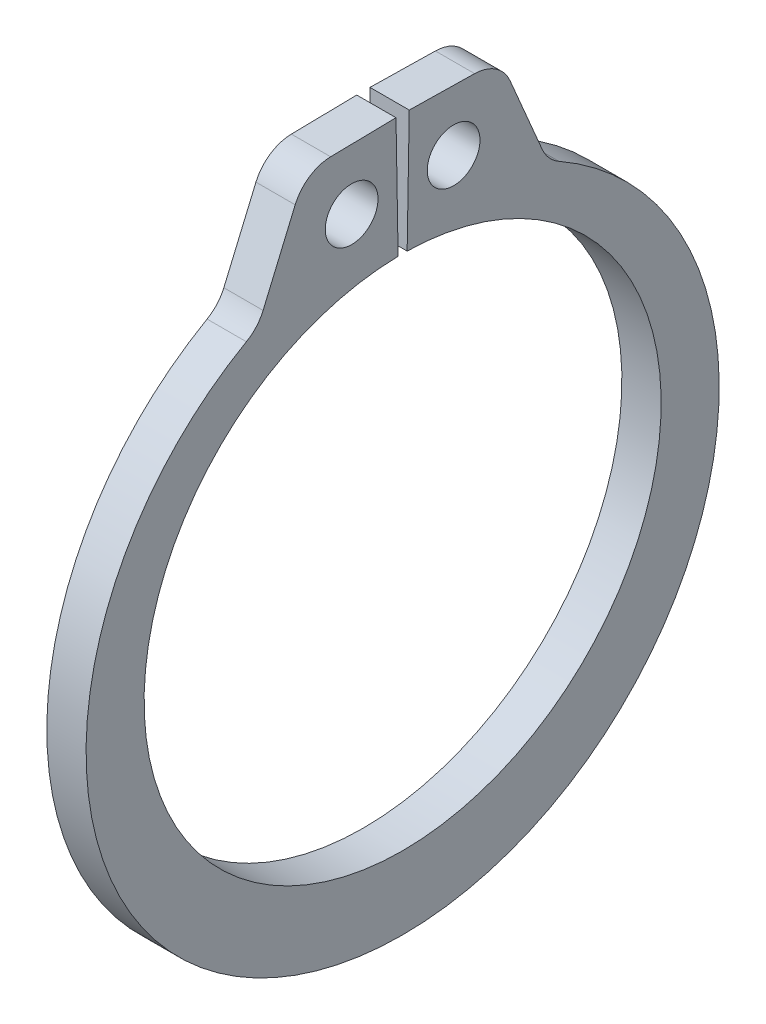
ISO-10303-21;
HEADER;
FILE_DESCRIPTION(('STEP AP214'),'2;1');
FILE_NAME('part.step','',(''),(''),'','','');
FILE_SCHEMA(('AUTOMOTIVE_DESIGN { 1 0 10303 214 1 1 1 1 }'));
ENDSEC;
DATA;
#1=APPLICATION_CONTEXT('core data for automotive mechanical design processes');
#2=APPLICATION_PROTOCOL_DEFINITION('international standard','automotive_design',2000,#1);
#3=PRODUCT_CONTEXT('',#1,'mechanical');
#4=PRODUCT('Part','Part','',(#3));
#5=PRODUCT_RELATED_PRODUCT_CATEGORY('part','',(#4));
#6=PRODUCT_DEFINITION_FORMATION('','',#4);
#7=PRODUCT_DEFINITION_CONTEXT('part definition',#1,'design');
#8=PRODUCT_DEFINITION('design','',#6,#7);
#9=PRODUCT_DEFINITION_SHAPE('','',#8);
#10=(LENGTH_UNIT() NAMED_UNIT(*) SI_UNIT(.MILLI.,.METRE.));
#11=(NAMED_UNIT(*) PLANE_ANGLE_UNIT() SI_UNIT($,.RADIAN.));
#12=(NAMED_UNIT(*) SI_UNIT($,.STERADIAN.) SOLID_ANGLE_UNIT());
#13=UNCERTAINTY_MEASURE_WITH_UNIT(LENGTH_MEASURE(1.E-05),#10,'distance_accuracy_value','');
#14=(GEOMETRIC_REPRESENTATION_CONTEXT(3) GLOBAL_UNCERTAINTY_ASSIGNED_CONTEXT((#13)) GLOBAL_UNIT_ASSIGNED_CONTEXT((#10,
#11,#12)) REPRESENTATION_CONTEXT('',''));
#15=CARTESIAN_POINT('',(0.,0.,0.));
#16=DIRECTION('',(0.,0.,1.));
#17=DIRECTION('',(1.,0.,0.));
#18=AXIS2_PLACEMENT_3D('',#15,#16,#17);
#19=CARTESIAN_POINT('',(0.4445,0.,0.));
#20=DIRECTION('',(1.,0.,0.));
#21=DIRECTION('',(0.,0.,-1.));
#22=AXIS2_PLACEMENT_3D('',#19,#20,#21);
#23=PLANE('',#22);
#24=CARTESIAN_POINT('',(0.4445,7.20724610900659,1.15465964864512));
#25=DIRECTION('',(1.,0.,0.));
#26=DIRECTION('',(0.,0.,-1.));
#27=AXIS2_PLACEMENT_3D('',#24,#25,#26);
#28=CIRCLE('',#27,0.5969);
#29=CARTESIAN_POINT('',(0.4445,7.20724610900659,0.557759648645121));
#30=VERTEX_POINT('',#29);
#31=EDGE_CURVE('E222',#30,#30,#28,.T.);
#32=ORIENTED_EDGE('',*,*,#31,.F.);
#33=EDGE_LOOP('',(#32));
#34=FACE_BOUND('',#33,.T.);
#35=DIRECTION('',(0.,-0.0174524064372841,0.999847695156391));
#36=VECTOR('',#35,1.);
#37=CARTESIAN_POINT('',(0.4445,8.59659049818514,0.150054045307121));
#38=LINE('',#37,#36);
#39=CARTESIAN_POINT('',(0.4445,8.59659049818514,0.150054045307121));
#40=VERTEX_POINT('',#39);
#41=CARTESIAN_POINT('',(0.4445,8.57074959100772,1.63047862600547));
#42=VERTEX_POINT('',#41);
#43=EDGE_CURVE('E134',#40,#42,#38,.T.);
#44=ORIENTED_EDGE('',*,*,#43,.T.);
#45=CARTESIAN_POINT('',(0.4445,7.68188499001368,1.61496343668273));
#46=DIRECTION('',(1.,0.,0.));
#47=DIRECTION('',(0.,0.,-1.));
#48=AXIS2_PLACEMENT_3D('',#45,#46,#47);
#49=CIRCLE('',#48,0.889);
#50=CARTESIAN_POINT('',(0.4445,8.02998759243226,2.43297662617873));
#51=VERTEX_POINT('',#50);
#52=EDGE_CURVE('E175',#42,#51,#49,.T.);
#53=ORIENTED_EDGE('',*,*,#52,.T.);
#54=DIRECTION('',(0.,-0.920149819455567,0.391566481910655));
#55=VECTOR('',#54,1.);
#56=CARTESIAN_POINT('',(0.4445,8.56068391718107,2.20714069332188));
#57=LINE('',#56,#55);
#58=CARTESIAN_POINT('',(0.4445,6.32221463110736,3.15971333386378));
#59=VERTEX_POINT('',#58);
#60=EDGE_CURVE('E214',#51,#59,#57,.T.);
#61=ORIENTED_EDGE('',*,*,#60,.T.);
#62=CARTESIAN_POINT('',(0.4445,6.67031723352593,3.97772652335978));
#63=DIRECTION('',(1.,0.,0.));
#64=DIRECTION('',(0.,0.,-1.));
#65=AXIS2_PLACEMENT_3D('',#62,#63,#64);
#66=CIRCLE('',#65,0.889);
#67=CARTESIAN_POINT('',(0.4445,5.89719335877508,3.53886381784672));
#68=VERTEX_POINT('',#67);
#69=EDGE_CURVE('E182',#59,#68,#66,.F.);
#70=ORIENTED_EDGE('',*,*,#69,.T.);
#71=CARTESIAN_POINT('',(0.4445,-0.337057291142251,0.));
#72=DIRECTION('',(1.,0.,0.));
#73=DIRECTION('',(0.,0.,-1.));
#74=AXIS2_PLACEMENT_3D('',#71,#72,#73);
#75=CIRCLE('',#74,7.16864270885775);
#76=CARTESIAN_POINT('',(0.4445,5.89719335877508,-3.53886381784672));
#77=VERTEX_POINT('',#76);
#78=EDGE_CURVE('E207',#68,#77,#75,.T.);
#79=ORIENTED_EDGE('',*,*,#78,.T.);
#80=CARTESIAN_POINT('',(0.4445,6.67031723352593,-3.97772652335978));
#81=DIRECTION('',(1.,0.,0.));
#82=DIRECTION('',(0.,0.,-1.));
#83=AXIS2_PLACEMENT_3D('',#80,#81,#82);
#84=CIRCLE('',#83,0.889);
#85=CARTESIAN_POINT('',(0.4445,6.32221463110736,-3.15971333386378));
#86=VERTEX_POINT('',#85);
#87=EDGE_CURVE('E11',#77,#86,#84,.F.);
#88=ORIENTED_EDGE('',*,*,#87,.T.);
#89=DIRECTION('',(0.,0.920149819455567,0.391566481910655));
#90=VECTOR('',#89,1.);
#91=CARTESIAN_POINT('',(0.4445,8.56068391718107,-2.20714069332188));
#92=LINE('',#91,#90);
#93=CARTESIAN_POINT('',(0.4445,8.02998759243226,-2.43297662617873));
#94=VERTEX_POINT('',#93);
#95=EDGE_CURVE('E206',#86,#94,#92,.T.);
#96=ORIENTED_EDGE('',*,*,#95,.T.);
#97=CARTESIAN_POINT('',(0.4445,7.68188499001368,-1.61496343668273));
#98=DIRECTION('',(1.,0.,0.));
#99=DIRECTION('',(0.,0.,-1.));
#100=AXIS2_PLACEMENT_3D('',#97,#98,#99);
#101=CIRCLE('',#100,0.889);
#102=CARTESIAN_POINT('',(0.4445,8.57074959100772,-1.63047862600547));
#103=VERTEX_POINT('',#102);
#104=EDGE_CURVE('E50',#94,#103,#101,.T.);
#105=ORIENTED_EDGE('',*,*,#104,.T.);
#106=DIRECTION('',(0.,0.0174524064372841,0.999847695156391));
#107=VECTOR('',#106,1.);
#108=CARTESIAN_POINT('',(0.4445,8.59659049818514,-0.150054045307121));
#109=LINE('',#108,#107);
#110=CARTESIAN_POINT('',(0.4445,8.59659049818514,-0.150054045307121));
#111=VERTEX_POINT('',#110);
#112=EDGE_CURVE('E211',#103,#111,#109,.T.);
#113=ORIENTED_EDGE('',*,*,#112,.T.);
#114=DIRECTION('',(0.,-0.999847695156391,0.0174524064372836));
#115=VECTOR('',#114,1.);
#116=CARTESIAN_POINT('',(0.4445,5.85380830083212,-0.102178603968364));
#117=LINE('',#116,#115);
#118=CARTESIAN_POINT('',(0.4445,5.85380830083212,-0.102178603968364));
#119=VERTEX_POINT('',#118);
#120=EDGE_CURVE('E140',#111,#119,#117,.T.);
#121=ORIENTED_EDGE('',*,*,#120,.T.);
#122=CARTESIAN_POINT('',(0.4445,0.,0.));
#123=DIRECTION('',(-1.,0.,0.));
#124=DIRECTION('',(0.,0.,-1.));
#125=AXIS2_PLACEMENT_3D('',#122,#123,#124);
#126=CIRCLE('',#125,5.8547);
#127=CARTESIAN_POINT('',(0.4445,5.85380830083212,0.102178603968364));
#128=VERTEX_POINT('',#127);
#129=EDGE_CURVE('E135',#119,#128,#126,.T.);
#130=ORIENTED_EDGE('',*,*,#129,.T.);
#131=DIRECTION('',(0.,0.999847695156391,0.0174524064372836));
#132=VECTOR('',#131,1.);
#133=CARTESIAN_POINT('',(0.4445,5.85380830083212,0.102178603968364));
#134=LINE('',#133,#132);
#135=EDGE_CURVE('E126',#128,#40,#134,.T.);
#136=ORIENTED_EDGE('',*,*,#135,.T.);
#137=EDGE_LOOP('',(#44,#53,#61,#70,#79,#88,#96,#105,#113,#121,#130,#136));
#138=FACE_BOUND('',#137,.T.);
#139=CARTESIAN_POINT('',(0.4445,7.20724610900659,-1.15465964864512));
#140=DIRECTION('',(1.,0.,0.));
#141=DIRECTION('',(0.,0.,-1.));
#142=AXIS2_PLACEMENT_3D('',#139,#140,#141);
#143=CIRCLE('',#142,0.5969);
#144=CARTESIAN_POINT('',(0.4445,7.20724610900659,-1.75155964864512));
#145=VERTEX_POINT('',#144);
#146=EDGE_CURVE('E248',#145,#145,#143,.T.);
#147=ORIENTED_EDGE('',*,*,#146,.F.);
#148=EDGE_LOOP('',(#147));
#149=FACE_BOUND('',#148,.T.);
#150=ADVANCED_FACE('F35',(#34,#138,#149),#23,.T.);
#151=CARTESIAN_POINT('',(-0.4445,0.,0.));
#152=DIRECTION('',(1.,0.,0.));
#153=DIRECTION('',(0.,0.,-1.));
#154=AXIS2_PLACEMENT_3D('',#151,#152,#153);
#155=PLANE('',#154);
#156=CARTESIAN_POINT('',(-0.4445,7.20724610900659,1.15465964864512));
#157=DIRECTION('',(1.,0.,0.));
#158=DIRECTION('',(0.,0.,-1.));
#159=AXIS2_PLACEMENT_3D('',#156,#157,#158);
#160=CIRCLE('',#159,0.5969);
#161=CARTESIAN_POINT('',(-0.4445,7.20724610900659,0.557759648645121));
#162=VERTEX_POINT('',#161);
#163=EDGE_CURVE('E245',#162,#162,#160,.T.);
#164=ORIENTED_EDGE('',*,*,#163,.T.);
#165=EDGE_LOOP('',(#164));
#166=FACE_BOUND('',#165,.T.);
#167=DIRECTION('',(0.,-0.920149819455567,0.391566481910655));
#168=VECTOR('',#167,1.);
#169=CARTESIAN_POINT('',(-0.4445,8.56068391718107,2.20714069332188));
#170=LINE('',#169,#168);
#171=CARTESIAN_POINT('',(-0.4445,8.02998759243226,2.43297662617873));
#172=VERTEX_POINT('',#171);
#173=CARTESIAN_POINT('',(-0.4445,6.32221463110736,3.15971333386378));
#174=VERTEX_POINT('',#173);
#175=EDGE_CURVE('E201',#172,#174,#170,.T.);
#176=ORIENTED_EDGE('',*,*,#175,.F.);
#177=CARTESIAN_POINT('',(-0.4445,7.68188499001368,1.61496343668273));
#178=DIRECTION('',(1.,0.,0.));
#179=DIRECTION('',(0.,0.,-1.));
#180=AXIS2_PLACEMENT_3D('',#177,#178,#179);
#181=CIRCLE('',#180,0.889);
#182=CARTESIAN_POINT('',(-0.4445,8.57074959100772,1.63047862600547));
#183=VERTEX_POINT('',#182);
#184=EDGE_CURVE('E171',#172,#183,#181,.F.);
#185=ORIENTED_EDGE('',*,*,#184,.T.);
#186=DIRECTION('',(0.,-0.0174524064372841,0.999847695156391));
#187=VECTOR('',#186,1.);
#188=CARTESIAN_POINT('',(-0.4445,8.59659049818514,0.150054045307121));
#189=LINE('',#188,#187);
#190=CARTESIAN_POINT('',(-0.4445,8.59659049818514,0.150054045307121));
#191=VERTEX_POINT('',#190);
#192=EDGE_CURVE('E224',#191,#183,#189,.T.);
#193=ORIENTED_EDGE('',*,*,#192,.F.);
#194=DIRECTION('',(0.,0.999847695156391,0.0174524064372836));
#195=VECTOR('',#194,1.);
#196=CARTESIAN_POINT('',(-0.4445,5.85380830083212,0.102178603968364));
#197=LINE('',#196,#195);
#198=CARTESIAN_POINT('',(-0.4445,5.85380830083212,0.102178603968364));
#199=VERTEX_POINT('',#198);
#200=EDGE_CURVE('E221',#199,#191,#197,.T.);
#201=ORIENTED_EDGE('',*,*,#200,.F.);
#202=CARTESIAN_POINT('',(-0.4445,0.,0.));
#203=DIRECTION('',(-1.,0.,0.));
#204=DIRECTION('',(0.,0.,-1.));
#205=AXIS2_PLACEMENT_3D('',#202,#203,#204);
#206=CIRCLE('',#205,5.8547);
#207=CARTESIAN_POINT('',(-0.4445,5.85380830083212,-0.102178603968364));
#208=VERTEX_POINT('',#207);
#209=EDGE_CURVE('E148',#208,#199,#206,.T.);
#210=ORIENTED_EDGE('',*,*,#209,.F.);
#211=DIRECTION('',(0.,-0.999847695156391,0.0174524064372836));
#212=VECTOR('',#211,1.);
#213=CARTESIAN_POINT('',(-0.4445,5.85380830083212,-0.102178603968364));
#214=LINE('',#213,#212);
#215=CARTESIAN_POINT('',(-0.4445,8.59659049818514,-0.150054045307121));
#216=VERTEX_POINT('',#215);
#217=EDGE_CURVE('E144',#216,#208,#214,.T.);
#218=ORIENTED_EDGE('',*,*,#217,.F.);
#219=DIRECTION('',(0.,0.0174524064372841,0.999847695156391));
#220=VECTOR('',#219,1.);
#221=CARTESIAN_POINT('',(-0.4445,8.59659049818514,-0.150054045307121));
#222=LINE('',#221,#220);
#223=CARTESIAN_POINT('',(-0.4445,8.57074959100772,-1.63047862600547));
#224=VERTEX_POINT('',#223);
#225=EDGE_CURVE('E229',#224,#216,#222,.T.);
#226=ORIENTED_EDGE('',*,*,#225,.F.);
#227=CARTESIAN_POINT('',(-0.4445,7.68188499001368,-1.61496343668273));
#228=DIRECTION('',(1.,0.,0.));
#229=DIRECTION('',(0.,0.,-1.));
#230=AXIS2_PLACEMENT_3D('',#227,#228,#229);
#231=CIRCLE('',#230,0.889);
#232=CARTESIAN_POINT('',(-0.4445,8.02998759243226,-2.43297662617873));
#233=VERTEX_POINT('',#232);
#234=EDGE_CURVE('E169',#224,#233,#231,.F.);
#235=ORIENTED_EDGE('',*,*,#234,.T.);
#236=DIRECTION('',(0.,0.920149819455567,0.391566481910655));
#237=VECTOR('',#236,1.);
#238=CARTESIAN_POINT('',(-0.4445,8.56068391718107,-2.20714069332188));
#239=LINE('',#238,#237);
#240=CARTESIAN_POINT('',(-0.4445,6.32221463110736,-3.15971333386378));
#241=VERTEX_POINT('',#240);
#242=EDGE_CURVE('E192',#241,#233,#239,.T.);
#243=ORIENTED_EDGE('',*,*,#242,.F.);
#244=CARTESIAN_POINT('',(-0.4445,6.67031723352593,-3.97772652335978));
#245=DIRECTION('',(1.,0.,0.));
#246=DIRECTION('',(0.,0.,-1.));
#247=AXIS2_PLACEMENT_3D('',#244,#245,#246);
#248=CIRCLE('',#247,0.889);
#249=CARTESIAN_POINT('',(-0.4445,5.89719335877508,-3.53886381784672));
#250=VERTEX_POINT('',#249);
#251=EDGE_CURVE('E43',#241,#250,#248,.T.);
#252=ORIENTED_EDGE('',*,*,#251,.T.);
#253=CARTESIAN_POINT('',(-0.4445,-0.337057291142251,0.));
#254=DIRECTION('',(1.,0.,0.));
#255=DIRECTION('',(0.,0.,-1.));
#256=AXIS2_PLACEMENT_3D('',#253,#254,#255);
#257=CIRCLE('',#256,7.16864270885775);
#258=CARTESIAN_POINT('',(-0.4445,5.89719335877508,3.53886381784672));
#259=VERTEX_POINT('',#258);
#260=EDGE_CURVE('E190',#259,#250,#257,.T.);
#261=ORIENTED_EDGE('',*,*,#260,.F.);
#262=CARTESIAN_POINT('',(-0.4445,6.67031723352593,3.97772652335978));
#263=DIRECTION('',(1.,0.,0.));
#264=DIRECTION('',(0.,0.,-1.));
#265=AXIS2_PLACEMENT_3D('',#262,#263,#264);
#266=CIRCLE('',#265,0.889);
#267=EDGE_CURVE('E180',#259,#174,#266,.T.);
#268=ORIENTED_EDGE('',*,*,#267,.T.);
#269=EDGE_LOOP('',(#176,#185,#193,#201,#210,#218,#226,#235,#243,#252,#261,#268));
#270=FACE_BOUND('',#269,.T.);
#271=CARTESIAN_POINT('',(-0.4445,7.20724610900659,-1.15465964864512));
#272=DIRECTION('',(1.,0.,0.));
#273=DIRECTION('',(0.,0.,-1.));
#274=AXIS2_PLACEMENT_3D('',#271,#272,#273);
#275=CIRCLE('',#274,0.5969);
#276=CARTESIAN_POINT('',(-0.4445,7.20724610900659,-1.75155964864512));
#277=VERTEX_POINT('',#276);
#278=EDGE_CURVE('E251',#277,#277,#275,.T.);
#279=ORIENTED_EDGE('',*,*,#278,.T.);
#280=EDGE_LOOP('',(#279));
#281=FACE_BOUND('',#280,.T.);
#282=ADVANCED_FACE('F188',(#166,#270,#281),#155,.F.);
#283=CARTESIAN_POINT('',(0.4445,0.,0.));
#284=DIRECTION('',(-1.,0.,0.));
#285=DIRECTION('',(0.,0.,1.));
#286=AXIS2_PLACEMENT_3D('',#283,#284,#285);
#287=CYLINDRICAL_SURFACE('',#286,5.8547);
#288=ORIENTED_EDGE('',*,*,#209,.T.);
#289=DIRECTION('',(-1.,0.,0.));
#290=VECTOR('',#289,1.);
#291=CARTESIAN_POINT('',(0.4445,5.85380830083212,0.102178603968364));
#292=LINE('',#291,#290);
#293=EDGE_CURVE('E130',#128,#199,#292,.T.);
#294=ORIENTED_EDGE('',*,*,#293,.F.);
#295=ORIENTED_EDGE('',*,*,#129,.F.);
#296=DIRECTION('',(-1.,0.,0.));
#297=VECTOR('',#296,1.);
#298=CARTESIAN_POINT('',(0.4445,5.85380830083212,-0.102178603968364));
#299=LINE('',#298,#297);
#300=EDGE_CURVE('E219',#119,#208,#299,.T.);
#301=ORIENTED_EDGE('',*,*,#300,.T.);
#302=EDGE_LOOP('',(#288,#294,#295,#301));
#303=FACE_BOUND('',#302,.T.);
#304=ADVANCED_FACE('F146',(#303),#287,.F.);
#305=CARTESIAN_POINT('',(0.4445,5.85380830083212,0.102178603968364));
#306=DIRECTION('',(0.,-0.0174524064372836,0.999847695156391));
#307=DIRECTION('',(0.,-0.999847695156391,-0.0174524064372836));
#308=AXIS2_PLACEMENT_3D('',#305,#306,#307);
#309=PLANE('',#308);
#310=ORIENTED_EDGE('',*,*,#200,.T.);
#311=DIRECTION('',(-1.,0.,0.));
#312=VECTOR('',#311,1.);
#313=CARTESIAN_POINT('',(0.4445,8.59659049818514,0.150054045307121));
#314=LINE('',#313,#312);
#315=EDGE_CURVE('E133',#40,#191,#314,.T.);
#316=ORIENTED_EDGE('',*,*,#315,.F.);
#317=ORIENTED_EDGE('',*,*,#135,.F.);
#318=ORIENTED_EDGE('',*,*,#293,.T.);
#319=EDGE_LOOP('',(#310,#316,#317,#318));
#320=FACE_BOUND('',#319,.T.);
#321=ADVANCED_FACE('F128',(#320),#309,.F.);
#322=CARTESIAN_POINT('',(0.4445,8.59659049818514,0.150054045307121));
#323=DIRECTION('',(0.,-0.999847695156391,-0.0174524064372841));
#324=DIRECTION('',(0.,0.0174524064372841,-0.999847695156391));
#325=AXIS2_PLACEMENT_3D('',#322,#323,#324);
#326=PLANE('',#325);
#327=ORIENTED_EDGE('',*,*,#192,.T.);
#328=DIRECTION('',(-1.,0.,0.));
#329=VECTOR('',#328,1.);
#330=CARTESIAN_POINT('',(0.4445,8.57074959100772,1.63047862600547));
#331=LINE('',#330,#329);
#332=EDGE_CURVE('E58',#183,#42,#331,.F.);
#333=ORIENTED_EDGE('',*,*,#332,.T.);
#334=ORIENTED_EDGE('',*,*,#43,.F.);
#335=ORIENTED_EDGE('',*,*,#315,.T.);
#336=EDGE_LOOP('',(#327,#333,#334,#335));
#337=FACE_BOUND('',#336,.T.);
#338=ADVANCED_FACE('F240',(#337),#326,.F.);
#339=CARTESIAN_POINT('',(0.4445,8.56068391718107,2.20714069332188));
#340=DIRECTION('',(0.,-0.391566481910655,-0.920149819455567));
#341=DIRECTION('',(0.,0.920149819455567,-0.391566481910655));
#342=AXIS2_PLACEMENT_3D('',#339,#340,#341);
#343=PLANE('',#342);
#344=ORIENTED_EDGE('',*,*,#175,.T.);
#345=DIRECTION('',(1.,0.,0.));
#346=VECTOR('',#345,1.);
#347=CARTESIAN_POINT('',(0.4445,6.32221463110736,3.15971333386378));
#348=LINE('',#347,#346);
#349=EDGE_CURVE('E162',#174,#59,#348,.T.);
#350=ORIENTED_EDGE('',*,*,#349,.T.);
#351=ORIENTED_EDGE('',*,*,#60,.F.);
#352=DIRECTION('',(-1.,0.,0.));
#353=VECTOR('',#352,1.);
#354=CARTESIAN_POINT('',(0.4445,8.02998759243226,2.43297662617873));
#355=LINE('',#354,#353);
#356=EDGE_CURVE('E159',#51,#172,#355,.T.);
#357=ORIENTED_EDGE('',*,*,#356,.T.);
#358=EDGE_LOOP('',(#344,#350,#351,#357));
#359=FACE_BOUND('',#358,.T.);
#360=ADVANCED_FACE('F281',(#359),#343,.F.);
#361=CARTESIAN_POINT('',(0.4445,-0.337057291142251,0.));
#362=DIRECTION('',(-1.,0.,0.));
#363=DIRECTION('',(0.,0.,1.));
#364=AXIS2_PLACEMENT_3D('',#361,#362,#363);
#365=CYLINDRICAL_SURFACE('',#364,7.16864270885775);
#366=ORIENTED_EDGE('',*,*,#78,.F.);
#367=DIRECTION('',(-1.,0.,0.));
#368=VECTOR('',#367,1.);
#369=CARTESIAN_POINT('',(0.4445,5.89719335877508,3.53886381784672));
#370=LINE('',#369,#368);
#371=EDGE_CURVE('E151',#68,#259,#370,.T.);
#372=ORIENTED_EDGE('',*,*,#371,.T.);
#373=ORIENTED_EDGE('',*,*,#260,.T.);
#374=DIRECTION('',(-1.,0.,0.));
#375=VECTOR('',#374,1.);
#376=CARTESIAN_POINT('',(0.4445,5.89719335877508,-3.53886381784672));
#377=LINE('',#376,#375);
#378=EDGE_CURVE('E149',#250,#77,#377,.F.);
#379=ORIENTED_EDGE('',*,*,#378,.T.);
#380=EDGE_LOOP('',(#366,#372,#373,#379));
#381=FACE_BOUND('',#380,.T.);
#382=ADVANCED_FACE('F198',(#381),#365,.T.);
#383=CARTESIAN_POINT('',(0.4445,8.56068391718107,-2.20714069332188));
#384=DIRECTION('',(0.,-0.391566481910655,0.920149819455567));
#385=DIRECTION('',(0.,-0.920149819455567,-0.391566481910655));
#386=AXIS2_PLACEMENT_3D('',#383,#384,#385);
#387=PLANE('',#386);
#388=ORIENTED_EDGE('',*,*,#95,.F.);
#389=DIRECTION('',(1.,0.,0.));
#390=VECTOR('',#389,1.);
#391=CARTESIAN_POINT('',(-0.4445,6.32221463110736,-3.15971333386378));
#392=LINE('',#391,#390);
#393=EDGE_CURVE('E166',#86,#241,#392,.F.);
#394=ORIENTED_EDGE('',*,*,#393,.T.);
#395=ORIENTED_EDGE('',*,*,#242,.T.);
#396=DIRECTION('',(-1.,0.,0.));
#397=VECTOR('',#396,1.);
#398=CARTESIAN_POINT('',(0.4445,8.02998759243226,-2.43297662617873));
#399=LINE('',#398,#397);
#400=EDGE_CURVE('E164',#233,#94,#399,.F.);
#401=ORIENTED_EDGE('',*,*,#400,.T.);
#402=EDGE_LOOP('',(#388,#394,#395,#401));
#403=FACE_BOUND('',#402,.T.);
#404=ADVANCED_FACE('F209',(#403),#387,.F.);
#405=CARTESIAN_POINT('',(0.4445,8.59659049818514,-0.150054045307121));
#406=DIRECTION('',(0.,-0.999847695156391,0.0174524064372841));
#407=DIRECTION('',(0.,-0.0174524064372841,-0.999847695156391));
#408=AXIS2_PLACEMENT_3D('',#405,#406,#407);
#409=PLANE('',#408);
#410=ORIENTED_EDGE('',*,*,#112,.F.);
#411=DIRECTION('',(-1.,0.,0.));
#412=VECTOR('',#411,1.);
#413=CARTESIAN_POINT('',(0.4445,8.57074959100772,-1.63047862600547));
#414=LINE('',#413,#412);
#415=EDGE_CURVE('E177',#103,#224,#414,.T.);
#416=ORIENTED_EDGE('',*,*,#415,.T.);
#417=ORIENTED_EDGE('',*,*,#225,.T.);
#418=DIRECTION('',(-1.,0.,0.));
#419=VECTOR('',#418,1.);
#420=CARTESIAN_POINT('',(0.4445,8.59659049818514,-0.150054045307121));
#421=LINE('',#420,#419);
#422=EDGE_CURVE('E153',#111,#216,#421,.T.);
#423=ORIENTED_EDGE('',*,*,#422,.F.);
#424=EDGE_LOOP('',(#410,#416,#417,#423));
#425=FACE_BOUND('',#424,.T.);
#426=ADVANCED_FACE('F274',(#425),#409,.F.);
#427=CARTESIAN_POINT('',(0.4445,5.85380830083212,-0.102178603968364));
#428=DIRECTION('',(0.,-0.0174524064372836,-0.999847695156391));
#429=DIRECTION('',(0.,0.999847695156391,-0.0174524064372836));
#430=AXIS2_PLACEMENT_3D('',#427,#428,#429);
#431=PLANE('',#430);
#432=ORIENTED_EDGE('',*,*,#217,.T.);
#433=ORIENTED_EDGE('',*,*,#300,.F.);
#434=ORIENTED_EDGE('',*,*,#120,.F.);
#435=ORIENTED_EDGE('',*,*,#422,.T.);
#436=EDGE_LOOP('',(#432,#433,#434,#435));
#437=FACE_BOUND('',#436,.T.);
#438=ADVANCED_FACE('F236',(#437),#431,.F.);
#439=CARTESIAN_POINT('',(0.4445,7.20724610900659,1.15465964864512));
#440=DIRECTION('',(-1.,0.,0.));
#441=DIRECTION('',(0.,0.,1.));
#442=AXIS2_PLACEMENT_3D('',#439,#440,#441);
#443=CYLINDRICAL_SURFACE('',#442,0.5969);
#444=ORIENTED_EDGE('',*,*,#31,.T.);
#445=EDGE_LOOP('',(#444));
#446=FACE_BOUND('',#445,.T.);
#447=ORIENTED_EDGE('',*,*,#163,.F.);
#448=EDGE_LOOP('',(#447));
#449=FACE_BOUND('',#448,.T.);
#450=ADVANCED_FACE('F269',(#446,#449),#443,.F.);
#451=CARTESIAN_POINT('',(0.4445,7.20724610900659,-1.15465964864512));
#452=DIRECTION('',(-1.,0.,0.));
#453=DIRECTION('',(0.,0.,1.));
#454=AXIS2_PLACEMENT_3D('',#451,#452,#453);
#455=CYLINDRICAL_SURFACE('',#454,0.5969);
#456=ORIENTED_EDGE('',*,*,#146,.T.);
#457=EDGE_LOOP('',(#456));
#458=FACE_BOUND('',#457,.T.);
#459=ORIENTED_EDGE('',*,*,#278,.F.);
#460=EDGE_LOOP('',(#459));
#461=FACE_BOUND('',#460,.T.);
#462=ADVANCED_FACE('F257',(#458,#461),#455,.F.);
#463=CARTESIAN_POINT('',(0.4445,6.67031723352593,3.97772652335978));
#464=DIRECTION('',(-1.,0.,0.));
#465=DIRECTION('',(0.,0.,1.));
#466=AXIS2_PLACEMENT_3D('',#463,#464,#465);
#467=CYLINDRICAL_SURFACE('',#466,0.889);
#468=ORIENTED_EDGE('',*,*,#69,.F.);
#469=ORIENTED_EDGE('',*,*,#349,.F.);
#470=ORIENTED_EDGE('',*,*,#267,.F.);
#471=ORIENTED_EDGE('',*,*,#371,.F.);
#472=EDGE_LOOP('',(#468,#469,#470,#471));
#473=FACE_BOUND('',#472,.T.);
#474=ADVANCED_FACE('F291',(#473),#467,.F.);
#475=CARTESIAN_POINT('',(0.4445,6.67031723352593,-3.97772652335978));
#476=DIRECTION('',(-1.,0.,0.));
#477=DIRECTION('',(0.,0.,1.));
#478=AXIS2_PLACEMENT_3D('',#475,#476,#477);
#479=CYLINDRICAL_SURFACE('',#478,0.889);
#480=ORIENTED_EDGE('',*,*,#87,.F.);
#481=ORIENTED_EDGE('',*,*,#378,.F.);
#482=ORIENTED_EDGE('',*,*,#251,.F.);
#483=ORIENTED_EDGE('',*,*,#393,.F.);
#484=EDGE_LOOP('',(#480,#481,#482,#483));
#485=FACE_BOUND('',#484,.T.);
#486=ADVANCED_FACE('F204',(#485),#479,.F.);
#487=CARTESIAN_POINT('',(0.4445,7.68188499001368,1.61496343668273));
#488=DIRECTION('',(-1.,0.,0.));
#489=DIRECTION('',(0.,0.,1.));
#490=AXIS2_PLACEMENT_3D('',#487,#488,#489);
#491=CYLINDRICAL_SURFACE('',#490,0.889);
#492=ORIENTED_EDGE('',*,*,#52,.F.);
#493=ORIENTED_EDGE('',*,*,#332,.F.);
#494=ORIENTED_EDGE('',*,*,#184,.F.);
#495=ORIENTED_EDGE('',*,*,#356,.F.);
#496=EDGE_LOOP('',(#492,#493,#494,#495));
#497=FACE_BOUND('',#496,.T.);
#498=ADVANCED_FACE('F296',(#497),#491,.T.);
#499=CARTESIAN_POINT('',(0.4445,7.68188499001368,-1.61496343668273));
#500=DIRECTION('',(-1.,0.,0.));
#501=DIRECTION('',(0.,0.,1.));
#502=AXIS2_PLACEMENT_3D('',#499,#500,#501);
#503=CYLINDRICAL_SURFACE('',#502,0.889);
#504=ORIENTED_EDGE('',*,*,#104,.F.);
#505=ORIENTED_EDGE('',*,*,#400,.F.);
#506=ORIENTED_EDGE('',*,*,#234,.F.);
#507=ORIENTED_EDGE('',*,*,#415,.F.);
#508=EDGE_LOOP('',(#504,#505,#506,#507));
#509=FACE_BOUND('',#508,.T.);
#510=ADVANCED_FACE('F37',(#509),#503,.T.);
#511=CLOSED_SHELL('',(#150,#282,#304,#321,#338,#360,#382,#404,#426,#438,#450,#462,#474,#486,
#498,#510));
#512=MANIFOLD_SOLID_BREP('B2',#511);
#513=ADVANCED_BREP_SHAPE_REPRESENTATION('',(#18,#512),#14);
#514=SHAPE_DEFINITION_REPRESENTATION(#9,#513);
ENDSEC;
END-ISO-10303-21;
